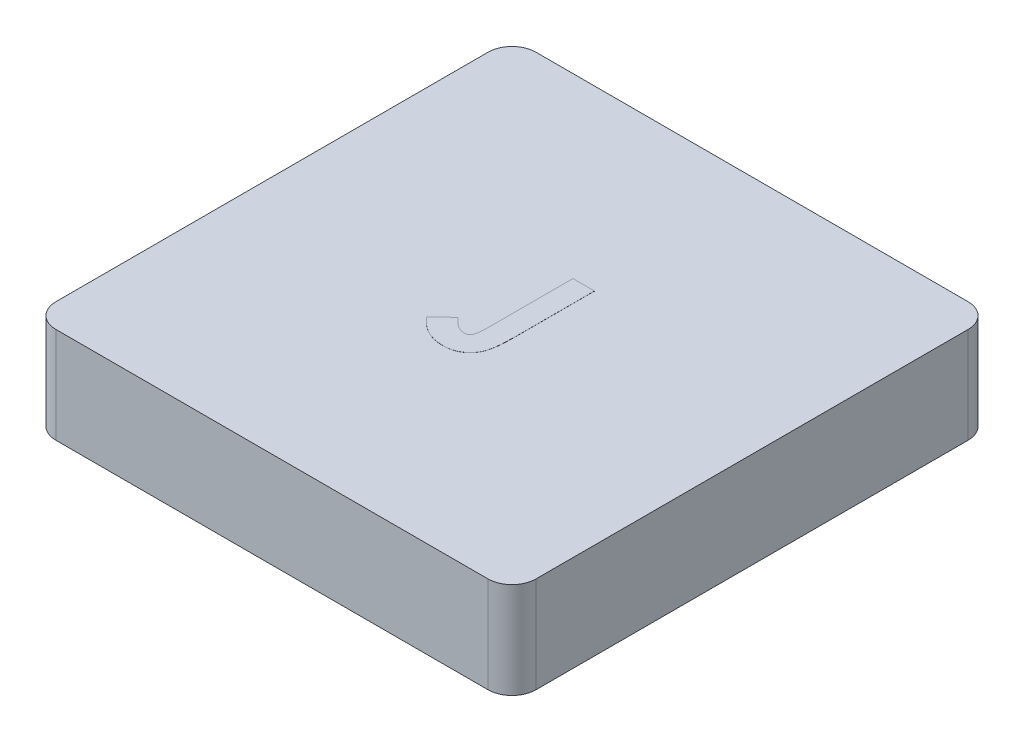
ISO-10303-21;
HEADER;
FILE_DESCRIPTION(('STEP AP214'),'2;1');
FILE_NAME('part.step','',(''),(''),'','','');
FILE_SCHEMA(('AUTOMOTIVE_DESIGN { 1 0 10303 214 1 1 1 1 }'));
ENDSEC;
DATA;
#1=APPLICATION_CONTEXT('core data for automotive mechanical design processes');
#2=APPLICATION_PROTOCOL_DEFINITION('international standard','automotive_design',2000,#1);
#3=PRODUCT_CONTEXT('',#1,'mechanical');
#4=PRODUCT('Part','Part','',(#3));
#5=PRODUCT_RELATED_PRODUCT_CATEGORY('part','',(#4));
#6=PRODUCT_DEFINITION_FORMATION('','',#4);
#7=PRODUCT_DEFINITION_CONTEXT('part definition',#1,'design');
#8=PRODUCT_DEFINITION('design','',#6,#7);
#9=PRODUCT_DEFINITION_SHAPE('','',#8);
#10=(LENGTH_UNIT() NAMED_UNIT(*) SI_UNIT(.MILLI.,.METRE.));
#11=(NAMED_UNIT(*) PLANE_ANGLE_UNIT() SI_UNIT($,.RADIAN.));
#12=(NAMED_UNIT(*) SI_UNIT($,.STERADIAN.) SOLID_ANGLE_UNIT());
#13=UNCERTAINTY_MEASURE_WITH_UNIT(LENGTH_MEASURE(1.E-05),#10,'distance_accuracy_value','');
#14=(GEOMETRIC_REPRESENTATION_CONTEXT(3) GLOBAL_UNCERTAINTY_ASSIGNED_CONTEXT((#13)) GLOBAL_UNIT_ASSIGNED_CONTEXT((#10,
#11,#12)) REPRESENTATION_CONTEXT('',''));
#15=CARTESIAN_POINT('',(0.,0.,0.));
#16=DIRECTION('',(0.,0.,1.));
#17=DIRECTION('',(1.,0.,0.));
#18=AXIS2_PLACEMENT_3D('',#15,#16,#17);
#19=CARTESIAN_POINT('',(0.,2.54,-12.7));
#20=DIRECTION('',(1.,0.,0.));
#21=DIRECTION('',(0.,0.,-1.));
#22=AXIS2_PLACEMENT_3D('',#19,#20,#21);
#23=PLANE('',#22);
#24=DIRECTION('',(0.,0.,1.));
#25=VECTOR('',#24,1.);
#26=CARTESIAN_POINT('',(0.,2.54,-12.7));
#27=LINE('',#26,#25);
#28=CARTESIAN_POINT('',(0.,2.54,-12.065));
#29=VERTEX_POINT('',#28);
#30=CARTESIAN_POINT('',(0.,2.54,-0.635));
#31=VERTEX_POINT('',#30);
#32=EDGE_CURVE('E329',#29,#31,#27,.T.);
#33=ORIENTED_EDGE('',*,*,#32,.F.);
#34=DIRECTION('',(0.,-1.,0.));
#35=VECTOR('',#34,1.);
#36=CARTESIAN_POINT('',(0.,2.54,-12.065));
#37=LINE('',#36,#35);
#38=CARTESIAN_POINT('',(0.,0.,-12.065));
#39=VERTEX_POINT('',#38);
#40=EDGE_CURVE('E350',#29,#39,#37,.T.);
#41=ORIENTED_EDGE('',*,*,#40,.T.);
#42=DIRECTION('',(0.,0.,1.));
#43=VECTOR('',#42,1.);
#44=CARTESIAN_POINT('',(0.,0.,-12.7));
#45=LINE('',#44,#43);
#46=CARTESIAN_POINT('',(0.,0.,-0.635));
#47=VERTEX_POINT('',#46);
#48=EDGE_CURVE('E339',#39,#47,#45,.T.);
#49=ORIENTED_EDGE('',*,*,#48,.T.);
#50=DIRECTION('',(0.,-1.,0.));
#51=VECTOR('',#50,1.);
#52=CARTESIAN_POINT('',(0.,2.54,-0.635));
#53=LINE('',#52,#51);
#54=EDGE_CURVE('E338',#47,#31,#53,.F.);
#55=ORIENTED_EDGE('',*,*,#54,.T.);
#56=EDGE_LOOP('',(#33,#41,#49,#55));
#57=FACE_BOUND('',#56,.T.);
#58=ADVANCED_FACE('F33',(#57),#23,.F.);
#59=CARTESIAN_POINT('',(0.,2.54,0.));
#60=DIRECTION('',(0.,0.,-1.));
#61=DIRECTION('',(-1.,0.,0.));
#62=AXIS2_PLACEMENT_3D('',#59,#60,#61);
#63=PLANE('',#62);
#64=DIRECTION('',(1.,0.,0.));
#65=VECTOR('',#64,1.);
#66=CARTESIAN_POINT('',(0.,0.,0.));
#67=LINE('',#66,#65);
#68=CARTESIAN_POINT('',(0.635,0.,0.));
#69=VERTEX_POINT('',#68);
#70=CARTESIAN_POINT('',(12.065,0.,0.));
#71=VERTEX_POINT('',#70);
#72=EDGE_CURVE('E324',#69,#71,#67,.T.);
#73=ORIENTED_EDGE('',*,*,#72,.T.);
#74=DIRECTION('',(0.,-1.,0.));
#75=VECTOR('',#74,1.);
#76=CARTESIAN_POINT('',(12.065,2.54,0.));
#77=LINE('',#76,#75);
#78=CARTESIAN_POINT('',(12.065,2.54,0.));
#79=VERTEX_POINT('',#78);
#80=EDGE_CURVE('E41',#71,#79,#77,.F.);
#81=ORIENTED_EDGE('',*,*,#80,.T.);
#82=DIRECTION('',(1.,0.,0.));
#83=VECTOR('',#82,1.);
#84=CARTESIAN_POINT('',(0.,2.54,0.));
#85=LINE('',#84,#83);
#86=CARTESIAN_POINT('',(0.635,2.54,0.));
#87=VERTEX_POINT('',#86);
#88=EDGE_CURVE('E321',#87,#79,#85,.T.);
#89=ORIENTED_EDGE('',*,*,#88,.F.);
#90=DIRECTION('',(0.,-1.,0.));
#91=VECTOR('',#90,1.);
#92=CARTESIAN_POINT('',(0.635,2.54,0.));
#93=LINE('',#92,#91);
#94=EDGE_CURVE('E317',#87,#69,#93,.T.);
#95=ORIENTED_EDGE('',*,*,#94,.T.);
#96=EDGE_LOOP('',(#73,#81,#89,#95));
#97=FACE_BOUND('',#96,.T.);
#98=ADVANCED_FACE('F273',(#97),#63,.F.);
#99=CARTESIAN_POINT('',(12.7,2.54,0.));
#100=DIRECTION('',(-1.,0.,0.));
#101=DIRECTION('',(0.,0.,1.));
#102=AXIS2_PLACEMENT_3D('',#99,#100,#101);
#103=PLANE('',#102);
#104=DIRECTION('',(0.,0.,-1.));
#105=VECTOR('',#104,1.);
#106=CARTESIAN_POINT('',(12.7,0.,0.));
#107=LINE('',#106,#105);
#108=CARTESIAN_POINT('',(12.7,0.,-0.635));
#109=VERTEX_POINT('',#108);
#110=CARTESIAN_POINT('',(12.7,0.,-12.065));
#111=VERTEX_POINT('',#110);
#112=EDGE_CURVE('E344',#109,#111,#107,.T.);
#113=ORIENTED_EDGE('',*,*,#112,.T.);
#114=DIRECTION('',(0.,-1.,0.));
#115=VECTOR('',#114,1.);
#116=CARTESIAN_POINT('',(12.7,2.54,-12.065));
#117=LINE('',#116,#115);
#118=CARTESIAN_POINT('',(12.7,2.54,-12.065));
#119=VERTEX_POINT('',#118);
#120=EDGE_CURVE('E315',#111,#119,#117,.F.);
#121=ORIENTED_EDGE('',*,*,#120,.T.);
#122=DIRECTION('',(0.,0.,-1.));
#123=VECTOR('',#122,1.);
#124=CARTESIAN_POINT('',(12.7,2.54,0.));
#125=LINE('',#124,#123);
#126=CARTESIAN_POINT('',(12.7,2.54,-0.635));
#127=VERTEX_POINT('',#126);
#128=EDGE_CURVE('E328',#127,#119,#125,.T.);
#129=ORIENTED_EDGE('',*,*,#128,.F.);
#130=DIRECTION('',(0.,-1.,0.));
#131=VECTOR('',#130,1.);
#132=CARTESIAN_POINT('',(12.7,2.54,-0.635));
#133=LINE('',#132,#131);
#134=EDGE_CURVE('E299',#127,#109,#133,.T.);
#135=ORIENTED_EDGE('',*,*,#134,.T.);
#136=EDGE_LOOP('',(#113,#121,#129,#135));
#137=FACE_BOUND('',#136,.T.);
#138=ADVANCED_FACE('F269',(#137),#103,.F.);
#139=CARTESIAN_POINT('',(12.7,2.54,-12.7));
#140=DIRECTION('',(0.,0.,1.));
#141=DIRECTION('',(1.,0.,0.));
#142=AXIS2_PLACEMENT_3D('',#139,#140,#141);
#143=PLANE('',#142);
#144=DIRECTION('',(-1.,0.,0.));
#145=VECTOR('',#144,1.);
#146=CARTESIAN_POINT('',(12.7,0.,-12.7));
#147=LINE('',#146,#145);
#148=CARTESIAN_POINT('',(12.065,0.,-12.7));
#149=VERTEX_POINT('',#148);
#150=CARTESIAN_POINT('',(0.634999999999995,0.,-12.7));
#151=VERTEX_POINT('',#150);
#152=EDGE_CURVE('E333',#149,#151,#147,.T.);
#153=ORIENTED_EDGE('',*,*,#152,.T.);
#154=DIRECTION('',(0.,-1.,0.));
#155=VECTOR('',#154,1.);
#156=CARTESIAN_POINT('',(0.634999999999995,2.54,-12.7));
#157=LINE('',#156,#155);
#158=CARTESIAN_POINT('',(0.634999999999995,2.54,-12.7));
#159=VERTEX_POINT('',#158);
#160=EDGE_CURVE('E309',#151,#159,#157,.F.);
#161=ORIENTED_EDGE('',*,*,#160,.T.);
#162=DIRECTION('',(-1.,0.,0.));
#163=VECTOR('',#162,1.);
#164=CARTESIAN_POINT('',(12.7,2.54,-12.7));
#165=LINE('',#164,#163);
#166=CARTESIAN_POINT('',(12.065,2.54,-12.7));
#167=VERTEX_POINT('',#166);
#168=EDGE_CURVE('E331',#167,#159,#165,.T.);
#169=ORIENTED_EDGE('',*,*,#168,.F.);
#170=DIRECTION('',(0.,-1.,0.));
#171=VECTOR('',#170,1.);
#172=CARTESIAN_POINT('',(12.065,2.54,-12.7));
#173=LINE('',#172,#171);
#174=EDGE_CURVE('E361',#167,#149,#173,.T.);
#175=ORIENTED_EDGE('',*,*,#174,.T.);
#176=EDGE_LOOP('',(#153,#161,#169,#175));
#177=FACE_BOUND('',#176,.T.);
#178=ADVANCED_FACE('F262',(#177),#143,.F.);
#179=CARTESIAN_POINT('',(0.,2.54,0.));
#180=DIRECTION('',(0.,1.,0.));
#181=DIRECTION('',(0.,0.,1.));
#182=AXIS2_PLACEMENT_3D('',#179,#180,#181);
#183=PLANE('',#182);
#184=DIRECTION('',(0.,0.,-1.));
#185=VECTOR('',#184,1.);
#186=CARTESIAN_POINT('',(6.31124871794871,2.54,-5.76094591346154));
#187=LINE('',#186,#185);
#188=CARTESIAN_POINT('',(6.31124871794871,2.54,-5.76094591346154));
#189=VERTEX_POINT('',#188);
#190=CARTESIAN_POINT('',(6.31124871794871,2.54,-8.001));
#191=VERTEX_POINT('',#190);
#192=EDGE_CURVE('E465',#189,#191,#187,.T.);
#193=ORIENTED_EDGE('',*,*,#192,.T.);
#194=DIRECTION('',(1.,0.,0.));
#195=VECTOR('',#194,1.);
#196=CARTESIAN_POINT('',(6.31124871794871,2.54,-8.001));
#197=LINE('',#196,#195);
#198=CARTESIAN_POINT('',(6.88112051282051,2.54,-8.001));
#199=VERTEX_POINT('',#198);
#200=EDGE_CURVE('E175',#191,#199,#197,.T.);
#201=ORIENTED_EDGE('',*,*,#200,.T.);
#202=DIRECTION('',(0.,0.,1.));
#203=VECTOR('',#202,1.);
#204=CARTESIAN_POINT('',(6.88112051282051,2.54,-8.001));
#205=LINE('',#204,#203);
#206=CARTESIAN_POINT('',(6.88112051282051,2.54,-5.89323758012821));
#207=VERTEX_POINT('',#206);
#208=EDGE_CURVE('E459',#199,#207,#205,.T.);
#209=ORIENTED_EDGE('',*,*,#208,.T.);
#210=CARTESIAN_POINT('',(6.88112051282051,2.54,-5.89323758012821));
#211=CARTESIAN_POINT('',(6.88091158071687,2.54,-5.85295254026278));
#212=CARTESIAN_POINT('',(6.88050900980352,2.54,-5.77533122209071));
#213=CARTESIAN_POINT('',(6.87647856088049,2.54,-5.66358517718184));
#214=CARTESIAN_POINT('',(6.87102868321345,2.54,-5.5611307310824));
#215=CARTESIAN_POINT('',(6.86318033355562,2.54,-5.46813204890725));
#216=CARTESIAN_POINT('',(6.85152338550951,2.54,-5.38459362780468));
#217=CARTESIAN_POINT('',(6.83833125978952,2.54,-5.31030704710015));
#218=CARTESIAN_POINT('',(6.82377668325185,2.54,-5.24496960972293));
#219=CARTESIAN_POINT('',(6.79919043205469,2.54,-5.17184685241292));
#220=CARTESIAN_POINT('',(6.76102098955045,2.54,-5.09087171656997));
#221=CARTESIAN_POINT('',(6.70342221127467,2.54,-5.00340706265142));
#222=CARTESIAN_POINT('',(6.63169329612528,2.54,-4.92741518238404));
#223=CARTESIAN_POINT('',(6.54908527900529,2.54,-4.86140745091114));
#224=CARTESIAN_POINT('',(6.45490212622968,2.54,-4.80914181373395));
#225=CARTESIAN_POINT('',(6.3513135961728,2.54,-4.77136407124898));
#226=CARTESIAN_POINT('',(6.23865083670719,2.54,-4.74879538622335));
#227=CARTESIAN_POINT('',(6.16061770898194,2.54,-4.74601908432728));
#228=CARTESIAN_POINT('',(6.12044342948717,2.54,-4.74458974358974));
#229=B_SPLINE_CURVE_WITH_KNOTS('',3,(#210,#211,#212,#213,#214,#215,#216,#217,#218,#219,#220,
#221,#222,#223,#224,#225,#226,#227,#228),.UNSPECIFIED.,.F.,.F.,(4,1,1,1,1,1,1,1,1,1,1,1,1,1,1,1,
4),(0.,0.0764053506058016,0.147218025580542,0.212058993569066,0.270999490309766,
0.324170992612472,0.371969814615873,0.414105230295776,0.450981256131895,0.518077209357027,
0.583319665547195,0.64875638268336,0.715449883456707,0.783134877260214,0.852084921522458,
0.923847962045423,1.),.UNSPECIFIED.);
#230=CARTESIAN_POINT('',(6.12044342948717,2.54,-4.74458974358974));
#231=VERTEX_POINT('',#230);
#232=EDGE_CURVE('E452',#207,#231,#229,.T.);
#233=ORIENTED_EDGE('',*,*,#232,.T.);
#234=CARTESIAN_POINT('',(6.12044342948718,2.54,-4.74458974358974));
#235=CARTESIAN_POINT('',(6.07858548605364,2.54,-4.74588561737008));
#236=CARTESIAN_POINT('',(5.99602527611185,2.54,-4.7484415865025));
#237=CARTESIAN_POINT('',(5.87494222556327,2.54,-4.77021187962806));
#238=CARTESIAN_POINT('',(5.7585662778997,2.54,-4.80511621003476));
#239=CARTESIAN_POINT('',(5.64749950097126,2.54,-4.85558368264152));
#240=CARTESIAN_POINT('',(5.54022024622526,2.54,-4.91880101083569));
#241=CARTESIAN_POINT('',(5.4386755338055,2.54,-4.99721595323105));
#242=CARTESIAN_POINT('',(5.34074524957005,2.54,-5.08839651853344));
#243=CARTESIAN_POINT('',(5.28269157928034,2.54,-5.15836619606181));
#244=CARTESIAN_POINT('',(5.25291538461538,2.54,-5.19425420673077));
#245=B_SPLINE_CURVE_WITH_KNOTS('',3,(#234,#235,#236,#237,#238,#239,#240,#241,#242,#243,#244),
.UNSPECIFIED.,.F.,.F.,(4,1,1,1,1,1,1,1,4),(0.,0.123873098257655,0.24432612210228,
0.363091916241498,0.482806410598963,0.604690738529227,0.73101201523036,0.862033897993612,1.),.UNSPECIFIED.);
#246=CARTESIAN_POINT('',(5.25291538461538,2.54,-5.19425420673077));
#247=VERTEX_POINT('',#246);
#248=EDGE_CURVE('E448',#231,#247,#245,.T.);
#249=ORIENTED_EDGE('',*,*,#248,.T.);
#250=DIRECTION('',(0.734180402826144,0.,-0.678954443321524));
#251=VECTOR('',#250,1.);
#252=CARTESIAN_POINT('',(5.25291538461538,2.54,-5.19425420673077));
#253=LINE('',#252,#251);
#254=CARTESIAN_POINT('',(5.68413533653846,2.54,-5.59303725961538));
#255=VERTEX_POINT('',#254);
#256=EDGE_CURVE('E443',#247,#255,#253,.T.);
#257=ORIENTED_EDGE('',*,*,#256,.T.);
#258=CARTESIAN_POINT('',(5.68413533653846,2.54,-5.59303725961538));
#259=CARTESIAN_POINT('',(5.70671352651177,2.54,-5.56750770293782));
#260=CARTESIAN_POINT('',(5.74896338985391,2.54,-5.51973503904901));
#261=CARTESIAN_POINT('',(5.81263268837479,2.54,-5.45743831205905));
#262=CARTESIAN_POINT('',(5.87006582634923,2.54,-5.40739008234386));
#263=CARTESIAN_POINT('',(5.92420626490365,2.54,-5.37128984356978));
#264=CARTESIAN_POINT('',(5.9752972979457,2.54,-5.34584320525591));
#265=CARTESIAN_POINT('',(6.02443818485929,2.54,-5.3275132762469));
#266=CARTESIAN_POINT('',(6.07316071775475,2.54,-5.3171374954758));
#267=CARTESIAN_POINT('',(6.10534830861267,2.54,-5.31534002274066));
#268=CARTESIAN_POINT('',(6.12107944711538,2.54,-5.31446153846154));
#269=B_SPLINE_CURVE_WITH_KNOTS('',3,(#258,#259,#260,#261,#262,#263,#264,#265,#266,#267,#268),
.UNSPECIFIED.,.F.,.F.,(4,1,1,1,1,1,1,1,4),(0.,0.191188734676117,0.357765521601646,
0.499586074062439,0.618044672839495,0.721795541859931,0.819272160926337,0.911672337320495,1.),.UNSPECIFIED.);
#270=CARTESIAN_POINT('',(6.12107944711538,2.54,-5.31446153846154));
#271=VERTEX_POINT('',#270);
#272=EDGE_CURVE('E53',#255,#271,#269,.T.);
#273=ORIENTED_EDGE('',*,*,#272,.T.);
#274=CARTESIAN_POINT('',(6.12107944711538,2.54,-5.31446153846154));
#275=CARTESIAN_POINT('',(6.13630543818843,2.54,-5.31525554937598));
#276=CARTESIAN_POINT('',(6.16558001345695,2.54,-5.31678217133231));
#277=CARTESIAN_POINT('',(6.20583367711112,2.54,-5.33375250942066));
#278=CARTESIAN_POINT('',(6.23977010602246,2.54,-5.36039665373477));
#279=CARTESIAN_POINT('',(6.26211184775168,2.54,-5.39102755498271));
#280=CARTESIAN_POINT('',(6.27634945003849,2.54,-5.42234058242528));
#281=CARTESIAN_POINT('',(6.28524537230499,2.54,-5.4526094371274));
#282=CARTESIAN_POINT('',(6.29368761792642,2.54,-5.48889359012024));
#283=CARTESIAN_POINT('',(6.30045135684294,2.54,-5.53117485612093));
#284=CARTESIAN_POINT('',(6.30556205012265,2.54,-5.58000473647157));
#285=CARTESIAN_POINT('',(6.3081093612352,2.54,-5.634790439109));
#286=CARTESIAN_POINT('',(6.31120721828109,2.54,-5.69582801747516));
#287=CARTESIAN_POINT('',(6.31123439280349,2.54,-5.73846806315622));
#288=CARTESIAN_POINT('',(6.31124871794871,2.54,-5.76094591346154));
#289=B_SPLINE_CURVE_WITH_KNOTS('',3,(#274,#275,#276,#277,#278,#279,#280,#281,#282,#283,#284,
#285,#286,#287,#288),.UNSPECIFIED.,.F.,.F.,(4,1,1,1,1,1,1,1,1,1,1,1,4),(0.,0.0836606106248744,
0.160851850693831,0.236744462245999,0.319647798711959,0.36732551225643,0.426209548529816,
0.493524089529687,0.573025277738409,0.66250602050281,0.764543201859918,0.875878119325884,1.),.UNSPECIFIED.);
#290=EDGE_CURVE('E48',#271,#189,#289,.T.);
#291=ORIENTED_EDGE('',*,*,#290,.T.);
#292=EDGE_LOOP('',(#193,#201,#209,#233,#249,#257,#273,#291));
#293=FACE_BOUND('',#292,.T.);
#294=ORIENTED_EDGE('',*,*,#168,.T.);
#295=CARTESIAN_POINT('',(0.634999999999995,2.54,-12.065));
#296=DIRECTION('',(0.,1.,0.));
#297=DIRECTION('',(0.,0.,1.));
#298=AXIS2_PLACEMENT_3D('',#295,#296,#297);
#299=CIRCLE('',#298,0.635);
#300=EDGE_CURVE('E307',#159,#29,#299,.T.);
#301=ORIENTED_EDGE('',*,*,#300,.T.);
#302=ORIENTED_EDGE('',*,*,#32,.T.);
#303=CARTESIAN_POINT('',(0.635,2.54,-0.635));
#304=DIRECTION('',(0.,1.,0.));
#305=DIRECTION('',(0.,0.,1.));
#306=AXIS2_PLACEMENT_3D('',#303,#304,#305);
#307=CIRCLE('',#306,0.635);
#308=EDGE_CURVE('E305',#31,#87,#307,.T.);
#309=ORIENTED_EDGE('',*,*,#308,.T.);
#310=ORIENTED_EDGE('',*,*,#88,.T.);
#311=CARTESIAN_POINT('',(12.065,2.54,-0.635));
#312=DIRECTION('',(0.,1.,0.));
#313=DIRECTION('',(0.,0.,1.));
#314=AXIS2_PLACEMENT_3D('',#311,#312,#313);
#315=CIRCLE('',#314,0.635);
#316=EDGE_CURVE('E297',#79,#127,#315,.T.);
#317=ORIENTED_EDGE('',*,*,#316,.T.);
#318=ORIENTED_EDGE('',*,*,#128,.T.);
#319=CARTESIAN_POINT('',(12.065,2.54,-12.065));
#320=DIRECTION('',(0.,1.,0.));
#321=DIRECTION('',(0.,0.,1.));
#322=AXIS2_PLACEMENT_3D('',#319,#320,#321);
#323=CIRCLE('',#322,0.635);
#324=EDGE_CURVE('E304',#119,#167,#323,.T.);
#325=ORIENTED_EDGE('',*,*,#324,.T.);
#326=EDGE_LOOP('',(#294,#301,#302,#309,#310,#317,#318,#325));
#327=FACE_BOUND('',#326,.T.);
#328=ADVANCED_FACE('F258',(#293,#327),#183,.T.);
#329=CARTESIAN_POINT('',(0.,0.,0.));
#330=DIRECTION('',(0.,1.,0.));
#331=DIRECTION('',(0.,0.,1.));
#332=AXIS2_PLACEMENT_3D('',#329,#330,#331);
#333=PLANE('',#332);
#334=DIRECTION('',(-1.,0.,0.));
#335=VECTOR('',#334,1.);
#336=CARTESIAN_POINT('',(12.7,0.,-12.065));
#337=LINE('',#336,#335);
#338=CARTESIAN_POINT('',(12.065,0.,-12.065));
#339=VERTEX_POINT('',#338);
#340=CARTESIAN_POINT('',(0.634999999999995,0.,-12.065));
#341=VERTEX_POINT('',#340);
#342=EDGE_CURVE('E402',#339,#341,#337,.T.);
#343=ORIENTED_EDGE('',*,*,#342,.T.);
#344=DIRECTION('',(0.,0.,1.));
#345=VECTOR('',#344,1.);
#346=CARTESIAN_POINT('',(0.634999999999995,0.,-12.7));
#347=LINE('',#346,#345);
#348=CARTESIAN_POINT('',(0.635,0.,-0.635));
#349=VERTEX_POINT('',#348);
#350=EDGE_CURVE('E397',#341,#349,#347,.T.);
#351=ORIENTED_EDGE('',*,*,#350,.T.);
#352=DIRECTION('',(1.,0.,0.));
#353=VECTOR('',#352,1.);
#354=CARTESIAN_POINT('',(0.,0.,-0.635));
#355=LINE('',#354,#353);
#356=CARTESIAN_POINT('',(12.065,0.,-0.635));
#357=VERTEX_POINT('',#356);
#358=EDGE_CURVE('E400',#349,#357,#355,.T.);
#359=ORIENTED_EDGE('',*,*,#358,.T.);
#360=DIRECTION('',(0.,0.,-1.));
#361=VECTOR('',#360,1.);
#362=CARTESIAN_POINT('',(12.065,0.,0.));
#363=LINE('',#362,#361);
#364=EDGE_CURVE('E405',#357,#339,#363,.T.);
#365=ORIENTED_EDGE('',*,*,#364,.T.);
#366=EDGE_LOOP('',(#343,#351,#359,#365));
#367=FACE_BOUND('',#366,.T.);
#368=ORIENTED_EDGE('',*,*,#48,.F.);
#369=CARTESIAN_POINT('',(0.634999999999995,0.,-12.065));
#370=DIRECTION('',(0.,1.,0.));
#371=DIRECTION('',(0.,0.,1.));
#372=AXIS2_PLACEMENT_3D('',#369,#370,#371);
#373=CIRCLE('',#372,0.635);
#374=EDGE_CURVE('E359',#39,#151,#373,.F.);
#375=ORIENTED_EDGE('',*,*,#374,.T.);
#376=ORIENTED_EDGE('',*,*,#152,.F.);
#377=CARTESIAN_POINT('',(12.065,0.,-12.065));
#378=DIRECTION('',(0.,1.,0.));
#379=DIRECTION('',(0.,0.,1.));
#380=AXIS2_PLACEMENT_3D('',#377,#378,#379);
#381=CIRCLE('',#380,0.635);
#382=EDGE_CURVE('E357',#149,#111,#381,.F.);
#383=ORIENTED_EDGE('',*,*,#382,.T.);
#384=ORIENTED_EDGE('',*,*,#112,.F.);
#385=CARTESIAN_POINT('',(12.065,0.,-0.635));
#386=DIRECTION('',(0.,1.,0.));
#387=DIRECTION('',(0.,0.,1.));
#388=AXIS2_PLACEMENT_3D('',#385,#386,#387);
#389=CIRCLE('',#388,0.635);
#390=EDGE_CURVE('E355',#109,#71,#389,.F.);
#391=ORIENTED_EDGE('',*,*,#390,.T.);
#392=ORIENTED_EDGE('',*,*,#72,.F.);
#393=CARTESIAN_POINT('',(0.635,0.,-0.635));
#394=DIRECTION('',(0.,1.,0.));
#395=DIRECTION('',(0.,0.,1.));
#396=AXIS2_PLACEMENT_3D('',#393,#394,#395);
#397=CIRCLE('',#396,0.635);
#398=EDGE_CURVE('E353',#69,#47,#397,.F.);
#399=ORIENTED_EDGE('',*,*,#398,.T.);
#400=EDGE_LOOP('',(#368,#375,#376,#383,#384,#391,#392,#399));
#401=FACE_BOUND('',#400,.T.);
#402=ADVANCED_FACE('F261',(#367,#401),#333,.F.);
#403=CARTESIAN_POINT('',(0.634999999999995,2.54,-12.065));
#404=DIRECTION('',(0.,-1.,0.));
#405=DIRECTION('',(0.,0.,-1.));
#406=AXIS2_PLACEMENT_3D('',#403,#404,#405);
#407=CYLINDRICAL_SURFACE('',#406,0.635);
#408=ORIENTED_EDGE('',*,*,#300,.F.);
#409=ORIENTED_EDGE('',*,*,#160,.F.);
#410=ORIENTED_EDGE('',*,*,#374,.F.);
#411=ORIENTED_EDGE('',*,*,#40,.F.);
#412=EDGE_LOOP('',(#408,#409,#410,#411));
#413=FACE_BOUND('',#412,.T.);
#414=ADVANCED_FACE('F265',(#413),#407,.T.);
#415=CARTESIAN_POINT('',(12.065,2.54,-12.065));
#416=DIRECTION('',(0.,-1.,0.));
#417=DIRECTION('',(0.,0.,-1.));
#418=AXIS2_PLACEMENT_3D('',#415,#416,#417);
#419=CYLINDRICAL_SURFACE('',#418,0.635);
#420=ORIENTED_EDGE('',*,*,#324,.F.);
#421=ORIENTED_EDGE('',*,*,#120,.F.);
#422=ORIENTED_EDGE('',*,*,#382,.F.);
#423=ORIENTED_EDGE('',*,*,#174,.F.);
#424=EDGE_LOOP('',(#420,#421,#422,#423));
#425=FACE_BOUND('',#424,.T.);
#426=ADVANCED_FACE('F283',(#425),#419,.T.);
#427=CARTESIAN_POINT('',(12.065,2.54,-0.635));
#428=DIRECTION('',(0.,-1.,0.));
#429=DIRECTION('',(0.,0.,-1.));
#430=AXIS2_PLACEMENT_3D('',#427,#428,#429);
#431=CYLINDRICAL_SURFACE('',#430,0.635);
#432=ORIENTED_EDGE('',*,*,#316,.F.);
#433=ORIENTED_EDGE('',*,*,#80,.F.);
#434=ORIENTED_EDGE('',*,*,#390,.F.);
#435=ORIENTED_EDGE('',*,*,#134,.F.);
#436=EDGE_LOOP('',(#432,#433,#434,#435));
#437=FACE_BOUND('',#436,.T.);
#438=ADVANCED_FACE('F286',(#437),#431,.T.);
#439=CARTESIAN_POINT('',(0.635,2.54,-0.635));
#440=DIRECTION('',(0.,-1.,0.));
#441=DIRECTION('',(0.,0.,-1.));
#442=AXIS2_PLACEMENT_3D('',#439,#440,#441);
#443=CYLINDRICAL_SURFACE('',#442,0.635);
#444=ORIENTED_EDGE('',*,*,#308,.F.);
#445=ORIENTED_EDGE('',*,*,#54,.F.);
#446=ORIENTED_EDGE('',*,*,#398,.F.);
#447=ORIENTED_EDGE('',*,*,#94,.F.);
#448=EDGE_LOOP('',(#444,#445,#446,#447));
#449=FACE_BOUND('',#448,.T.);
#450=ADVANCED_FACE('F35',(#449),#443,.T.);
#451=CARTESIAN_POINT('',(0.634999999999995,2.54,-12.7));
#452=DIRECTION('',(1.,0.,0.));
#453=DIRECTION('',(0.,0.,-1.));
#454=AXIS2_PLACEMENT_3D('',#451,#452,#453);
#455=PLANE('',#454);
#456=DIRECTION('',(0.,0.,1.));
#457=VECTOR('',#456,1.);
#458=CARTESIAN_POINT('',(0.634999999999995,1.905,-12.7));
#459=LINE('',#458,#457);
#460=CARTESIAN_POINT('',(0.634999999999995,1.905,-12.065));
#461=VERTEX_POINT('',#460);
#462=CARTESIAN_POINT('',(0.635,1.905,-0.635));
#463=VERTEX_POINT('',#462);
#464=EDGE_CURVE('E391',#461,#463,#459,.T.);
#465=ORIENTED_EDGE('',*,*,#464,.T.);
#466=DIRECTION('',(0.,1.,0.));
#467=VECTOR('',#466,1.);
#468=CARTESIAN_POINT('',(0.635,2.54,-0.635));
#469=LINE('',#468,#467);
#470=EDGE_CURVE('E387',#349,#463,#469,.T.);
#471=ORIENTED_EDGE('',*,*,#470,.F.);
#472=ORIENTED_EDGE('',*,*,#350,.F.);
#473=DIRECTION('',(0.,1.,0.));
#474=VECTOR('',#473,1.);
#475=CARTESIAN_POINT('',(0.634999999999995,2.54,-12.065));
#476=LINE('',#475,#474);
#477=EDGE_CURVE('E383',#341,#461,#476,.T.);
#478=ORIENTED_EDGE('',*,*,#477,.T.);
#479=EDGE_LOOP('',(#465,#471,#472,#478));
#480=FACE_BOUND('',#479,.T.);
#481=ADVANCED_FACE('F239',(#480),#455,.T.);
#482=CARTESIAN_POINT('',(0.,2.54,-0.635));
#483=DIRECTION('',(0.,0.,-1.));
#484=DIRECTION('',(-1.,0.,0.));
#485=AXIS2_PLACEMENT_3D('',#482,#483,#484);
#486=PLANE('',#485);
#487=ORIENTED_EDGE('',*,*,#358,.F.);
#488=ORIENTED_EDGE('',*,*,#470,.T.);
#489=DIRECTION('',(1.,0.,0.));
#490=VECTOR('',#489,1.);
#491=CARTESIAN_POINT('',(0.,1.905,-0.635));
#492=LINE('',#491,#490);
#493=CARTESIAN_POINT('',(12.065,1.905,-0.635));
#494=VERTEX_POINT('',#493);
#495=EDGE_CURVE('E389',#463,#494,#492,.T.);
#496=ORIENTED_EDGE('',*,*,#495,.T.);
#497=DIRECTION('',(0.,1.,0.));
#498=VECTOR('',#497,1.);
#499=CARTESIAN_POINT('',(12.065,2.54,-0.635));
#500=LINE('',#499,#498);
#501=EDGE_CURVE('E342',#357,#494,#500,.T.);
#502=ORIENTED_EDGE('',*,*,#501,.F.);
#503=EDGE_LOOP('',(#487,#488,#496,#502));
#504=FACE_BOUND('',#503,.T.);
#505=ADVANCED_FACE('F242',(#504),#486,.T.);
#506=CARTESIAN_POINT('',(12.065,2.54,0.));
#507=DIRECTION('',(-1.,0.,0.));
#508=DIRECTION('',(0.,0.,1.));
#509=AXIS2_PLACEMENT_3D('',#506,#507,#508);
#510=PLANE('',#509);
#511=ORIENTED_EDGE('',*,*,#364,.F.);
#512=ORIENTED_EDGE('',*,*,#501,.T.);
#513=DIRECTION('',(0.,0.,-1.));
#514=VECTOR('',#513,1.);
#515=CARTESIAN_POINT('',(12.065,1.905,0.));
#516=LINE('',#515,#514);
#517=CARTESIAN_POINT('',(12.065,1.905,-12.065));
#518=VERTEX_POINT('',#517);
#519=EDGE_CURVE('E390',#494,#518,#516,.T.);
#520=ORIENTED_EDGE('',*,*,#519,.T.);
#521=DIRECTION('',(0.,1.,0.));
#522=VECTOR('',#521,1.);
#523=CARTESIAN_POINT('',(12.065,2.54,-12.065));
#524=LINE('',#523,#522);
#525=EDGE_CURVE('E377',#339,#518,#524,.T.);
#526=ORIENTED_EDGE('',*,*,#525,.F.);
#527=EDGE_LOOP('',(#511,#512,#520,#526));
#528=FACE_BOUND('',#527,.T.);
#529=ADVANCED_FACE('F246',(#528),#510,.T.);
#530=CARTESIAN_POINT('',(12.7,2.54,-12.065));
#531=DIRECTION('',(0.,0.,1.));
#532=DIRECTION('',(1.,0.,0.));
#533=AXIS2_PLACEMENT_3D('',#530,#531,#532);
#534=PLANE('',#533);
#535=ORIENTED_EDGE('',*,*,#342,.F.);
#536=ORIENTED_EDGE('',*,*,#525,.T.);
#537=DIRECTION('',(-1.,0.,0.));
#538=VECTOR('',#537,1.);
#539=CARTESIAN_POINT('',(12.7,1.905,-12.065));
#540=LINE('',#539,#538);
#541=EDGE_CURVE('E394',#518,#461,#540,.T.);
#542=ORIENTED_EDGE('',*,*,#541,.T.);
#543=ORIENTED_EDGE('',*,*,#477,.F.);
#544=EDGE_LOOP('',(#535,#536,#542,#543));
#545=FACE_BOUND('',#544,.T.);
#546=ADVANCED_FACE('F250',(#545),#534,.T.);
#547=CARTESIAN_POINT('',(0.,1.905,0.));
#548=DIRECTION('',(0.,1.,0.));
#549=DIRECTION('',(0.,0.,1.));
#550=AXIS2_PLACEMENT_3D('',#547,#548,#549);
#551=PLANE('',#550);
#552=CARTESIAN_POINT('',(6.34999999999999,1.905,-6.35));
#553=DIRECTION('',(0.,1.,0.));
#554=DIRECTION('',(0.,0.,1.));
#555=AXIS2_PLACEMENT_3D('',#552,#553,#554);
#556=CIRCLE('',#555,2.54);
#557=CARTESIAN_POINT('',(6.34999999999999,1.905,-3.81));
#558=VERTEX_POINT('',#557);
#559=EDGE_CURVE('E11',#558,#558,#556,.F.);
#560=ORIENTED_EDGE('',*,*,#559,.F.);
#561=EDGE_LOOP('',(#560));
#562=FACE_BOUND('',#561,.T.);
#563=ORIENTED_EDGE('',*,*,#541,.F.);
#564=ORIENTED_EDGE('',*,*,#519,.F.);
#565=ORIENTED_EDGE('',*,*,#495,.F.);
#566=ORIENTED_EDGE('',*,*,#464,.F.);
#567=EDGE_LOOP('',(#563,#564,#565,#566));
#568=FACE_BOUND('',#567,.T.);
#569=ADVANCED_FACE('F237',(#562,#568),#551,.F.);
#570=CARTESIAN_POINT('',(6.34999999999999,-7.18420489685532,-6.35));
#571=DIRECTION('',(0.,1.,0.));
#572=DIRECTION('',(0.,0.,1.));
#573=AXIS2_PLACEMENT_3D('',#570,#571,#572);
#574=CYLINDRICAL_SURFACE('',#573,2.54);
#575=CARTESIAN_POINT('',(6.34999999999999,0.,-6.35));
#576=DIRECTION('',(0.,1.,0.));
#577=DIRECTION('',(0.,0.,1.));
#578=AXIS2_PLACEMENT_3D('',#575,#576,#577);
#579=CIRCLE('',#578,2.54);
#580=CARTESIAN_POINT('',(6.34999999999999,0.,-3.81));
#581=VERTEX_POINT('',#580);
#582=EDGE_CURVE('E401',#581,#581,#579,.T.);
#583=CARTESIAN_POINT('',(6.34999999999999,0.,-3.81));
#584=CARTESIAN_POINT('',(6.34999999999999,0.0198437499999991,-3.81));
#585=CARTESIAN_POINT('',(6.34999999999999,0.0396874999999989,-3.81));
#586=CARTESIAN_POINT('',(6.34999999999999,0.079374999999999,-3.81));
#587=CARTESIAN_POINT('',(6.34999999999999,0.0992187499999992,-3.81));
#588=CARTESIAN_POINT('',(6.34999999999999,0.138906249999999,-3.81));
#589=CARTESIAN_POINT('',(6.34999999999999,0.158749999999999,-3.81));
#590=CARTESIAN_POINT('',(6.34999999999999,0.198437499999999,-3.81));
#591=CARTESIAN_POINT('',(6.34999999999999,0.218281249999999,-3.81));
#592=CARTESIAN_POINT('',(6.34999999999999,0.25796875,-3.81));
#593=CARTESIAN_POINT('',(6.34999999999999,0.277812499999999,-3.81));
#594=CARTESIAN_POINT('',(6.34999999999999,0.317499999999999,-3.81));
#595=CARTESIAN_POINT('',(6.34999999999999,0.337343749999999,-3.81));
#596=CARTESIAN_POINT('',(6.34999999999999,0.377031249999999,-3.81));
#597=CARTESIAN_POINT('',(6.34999999999999,0.396874999999999,-3.81));
#598=CARTESIAN_POINT('',(6.34999999999999,0.436562499999999,-3.81));
#599=CARTESIAN_POINT('',(6.34999999999999,0.456406249999999,-3.81));
#600=CARTESIAN_POINT('',(6.34999999999999,0.496093749999999,-3.81));
#601=CARTESIAN_POINT('',(6.34999999999999,0.515937499999999,-3.81));
#602=CARTESIAN_POINT('',(6.34999999999999,0.555624999999999,-3.81));
#603=CARTESIAN_POINT('',(6.34999999999999,0.575468749999999,-3.81));
#604=CARTESIAN_POINT('',(6.34999999999999,0.615156249999999,-3.81));
#605=CARTESIAN_POINT('',(6.34999999999999,0.634999999999999,-3.81));
#606=CARTESIAN_POINT('',(6.34999999999999,0.674687499999998,-3.81));
#607=CARTESIAN_POINT('',(6.34999999999999,0.694531249999998,-3.81));
#608=CARTESIAN_POINT('',(6.34999999999999,0.734218749999998,-3.81));
#609=CARTESIAN_POINT('',(6.34999999999999,0.754062499999998,-3.81));
#610=CARTESIAN_POINT('',(6.34999999999999,0.793749999999998,-3.81));
#611=CARTESIAN_POINT('',(6.34999999999999,0.813593749999999,-3.81));
#612=CARTESIAN_POINT('',(6.34999999999999,0.853281249999999,-3.81));
#613=CARTESIAN_POINT('',(6.34999999999999,0.873124999999999,-3.81));
#614=CARTESIAN_POINT('',(6.34999999999999,0.912812499999999,-3.81));
#615=CARTESIAN_POINT('',(6.34999999999999,0.932656249999999,-3.81));
#616=CARTESIAN_POINT('',(6.34999999999999,0.972343749999998,-3.81));
#617=CARTESIAN_POINT('',(6.34999999999999,0.992187499999998,-3.81));
#618=CARTESIAN_POINT('',(6.34999999999999,1.031875,-3.81));
#619=CARTESIAN_POINT('',(6.34999999999999,1.05171875,-3.81));
#620=CARTESIAN_POINT('',(6.34999999999999,1.09140625,-3.81));
#621=CARTESIAN_POINT('',(6.34999999999999,1.11125,-3.81));
#622=CARTESIAN_POINT('',(6.34999999999999,1.1509375,-3.81));
#623=CARTESIAN_POINT('',(6.34999999999999,1.17078125,-3.81));
#624=CARTESIAN_POINT('',(6.34999999999999,1.21046875,-3.81));
#625=CARTESIAN_POINT('',(6.34999999999999,1.2303125,-3.81));
#626=CARTESIAN_POINT('',(6.34999999999999,1.27,-3.81));
#627=CARTESIAN_POINT('',(6.34999999999999,1.28984375,-3.81));
#628=CARTESIAN_POINT('',(6.34999999999999,1.32953125,-3.81));
#629=CARTESIAN_POINT('',(6.34999999999999,1.349375,-3.81));
#630=CARTESIAN_POINT('',(6.34999999999999,1.3890625,-3.81));
#631=CARTESIAN_POINT('',(6.34999999999999,1.40890625,-3.81));
#632=CARTESIAN_POINT('',(6.34999999999999,1.44859375,-3.81));
#633=CARTESIAN_POINT('',(6.34999999999999,1.4684375,-3.81));
#634=CARTESIAN_POINT('',(6.34999999999999,1.508125,-3.81));
#635=CARTESIAN_POINT('',(6.34999999999999,1.52796875,-3.81));
#636=CARTESIAN_POINT('',(6.34999999999999,1.56765625,-3.81));
#637=CARTESIAN_POINT('',(6.34999999999999,1.5875,-3.81));
#638=CARTESIAN_POINT('',(6.34999999999999,1.6271875,-3.81));
#639=CARTESIAN_POINT('',(6.34999999999999,1.64703125,-3.81));
#640=CARTESIAN_POINT('',(6.34999999999999,1.68671875,-3.81));
#641=CARTESIAN_POINT('',(6.34999999999999,1.7065625,-3.81));
#642=CARTESIAN_POINT('',(6.34999999999999,1.74625,-3.81));
#643=CARTESIAN_POINT('',(6.34999999999999,1.76609375,-3.81));
#644=CARTESIAN_POINT('',(6.34999999999999,1.80578125,-3.81));
#645=CARTESIAN_POINT('',(6.34999999999999,1.825625,-3.81));
#646=CARTESIAN_POINT('',(6.34999999999999,1.8653125,-3.81));
#647=CARTESIAN_POINT('',(6.34999999999999,1.88515625,-3.81));
#648=CARTESIAN_POINT('',(6.34999999999999,1.905,-3.81));
#649=B_SPLINE_CURVE_WITH_KNOTS('',3,(#583,#584,#585,#586,#587,#588,#589,#590,#591,#592,#593,
#594,#595,#596,#597,#598,#599,#600,#601,#602,#603,#604,#605,#606,#607,#608,#609,#610,#611,#612,
#613,#614,#615,#616,#617,#618,#619,#620,#621,#622,#623,#624,#625,#626,#627,#628,#629,#630,#631,
#632,#633,#634,#635,#636,#637,#638,#639,#640,#641,#642,#643,#644,#645,#646,#647,#648),
.UNSPECIFIED.,.F.,.F.,(4,2,2,2,2,2,2,2,2,2,2,2,2,2,2,2,2,2,2,2,2,2,2,2,2,2,2,2,2,2,2,2,4),(0.,
0.0595312499999997,0.1190625,0.17859375,0.238125,0.29765625,0.3571875,0.41671875,0.47625,
0.53578125,0.5953125,0.654843749999999,0.714374999999999,0.773906249999999,0.8334375,0.89296875,
0.952499999999999,1.01203125,1.0715625,1.13109375,1.190625,1.25015625,1.3096875,1.36921875,
1.42875,1.48828125,1.5478125,1.60734375,1.666875,1.72640625,1.7859375,1.84546875,1.905),.UNSPECIFIED.);
#650=EDGE_CURVE('BSEAM233',#581,#558,#649,.T.);
#651=ORIENTED_EDGE('',*,*,#582,.T.);
#652=ORIENTED_EDGE('',*,*,#559,.T.);
#653=ORIENTED_EDGE('',*,*,#650,.T.);
#654=ORIENTED_EDGE('',*,*,#650,.F.);
#655=EDGE_LOOP('',(#651,#653,#652,#654));
#656=FACE_BOUND('',#655,.T.);
#657=ADVANCED_FACE('F233',(#656),#574,.T.);
#658=CARTESIAN_POINT('',(0.,0.,0.));
#659=DIRECTION('',(0.,1.,0.));
#660=DIRECTION('',(0.,0.,1.));
#661=AXIS2_PLACEMENT_3D('',#658,#659,#660);
#662=PLANE('',#661);
#663=ORIENTED_EDGE('',*,*,#582,.F.);
#664=EDGE_LOOP('',(#663));
#665=FACE_BOUND('',#664,.T.);
#666=ADVANCED_FACE('F230',(#665),#662,.F.);
#667=CARTESIAN_POINT('',(6.31124871794871,2.54254,-5.76094591346154));
#668=DIRECTION('',(-1.,0.,0.));
#669=DIRECTION('',(0.,0.,1.));
#670=AXIS2_PLACEMENT_3D('',#667,#668,#669);
#671=PLANE('',#670);
#672=ORIENTED_EDGE('',*,*,#192,.F.);
#673=DIRECTION('',(0.,-1.,0.));
#674=VECTOR('',#673,1.);
#675=CARTESIAN_POINT('',(6.31124871794871,2.54254,-5.76094591346154));
#676=LINE('',#675,#674);
#677=CARTESIAN_POINT('',(6.31124871794871,2.54254,-5.76094591346154));
#678=VERTEX_POINT('',#677);
#679=EDGE_CURVE('E194',#678,#189,#676,.T.);
#680=ORIENTED_EDGE('',*,*,#679,.F.);
#681=DIRECTION('',(0.,0.,-1.));
#682=VECTOR('',#681,1.);
#683=CARTESIAN_POINT('',(6.31124871794871,2.54254,-5.76094591346154));
#684=LINE('',#683,#682);
#685=CARTESIAN_POINT('',(6.31124871794871,2.54254,-8.001));
#686=VERTEX_POINT('',#685);
#687=EDGE_CURVE('E187',#678,#686,#684,.T.);
#688=ORIENTED_EDGE('',*,*,#687,.T.);
#689=DIRECTION('',(0.,-1.,0.));
#690=VECTOR('',#689,1.);
#691=CARTESIAN_POINT('',(6.31124871794871,2.54254,-8.001));
#692=LINE('',#691,#690);
#693=EDGE_CURVE('E170',#686,#191,#692,.T.);
#694=ORIENTED_EDGE('',*,*,#693,.T.);
#695=EDGE_LOOP('',(#672,#680,#688,#694));
#696=FACE_BOUND('',#695,.T.);
#697=ADVANCED_FACE('F193',(#696),#671,.T.);
#698=CARTESIAN_POINT('',(6.12107944711538,2.54254,-5.31446153846154));
#699=CARTESIAN_POINT('',(6.13630543818843,2.54254,-5.31525554937598));
#700=CARTESIAN_POINT('',(6.16558001345695,2.54254,-5.31678217133231));
#701=CARTESIAN_POINT('',(6.20583367711112,2.54254,-5.33375250942066));
#702=CARTESIAN_POINT('',(6.23977010602246,2.54254,-5.36039665373477));
#703=CARTESIAN_POINT('',(6.26211184775168,2.54254,-5.39102755498271));
#704=CARTESIAN_POINT('',(6.27634945003849,2.54254,-5.42234058242528));
#705=CARTESIAN_POINT('',(6.28524537230499,2.54254,-5.4526094371274));
#706=CARTESIAN_POINT('',(6.29368761792642,2.54254,-5.48889359012024));
#707=CARTESIAN_POINT('',(6.30045135684294,2.54254,-5.53117485612093));
#708=CARTESIAN_POINT('',(6.30556205012265,2.54254,-5.58000473647157));
#709=CARTESIAN_POINT('',(6.3081093612352,2.54254,-5.634790439109));
#710=CARTESIAN_POINT('',(6.31120721828109,2.54254,-5.69582801747516));
#711=CARTESIAN_POINT('',(6.31123439280349,2.54254,-5.73846806315622));
#712=CARTESIAN_POINT('',(6.31124871794871,2.54254,-5.76094591346154));
#713=B_SPLINE_CURVE_WITH_KNOTS('',3,(#698,#699,#700,#701,#702,#703,#704,#705,#706,#707,#708,
#709,#710,#711,#712),.UNSPECIFIED.,.F.,.F.,(4,1,1,1,1,1,1,1,1,1,1,1,4),(0.,0.0836606106248744,
0.160851850693831,0.236744462245999,0.319647798711959,0.36732551225643,0.426209548529816,
0.493524089529687,0.573025277738409,0.66250602050281,0.764543201859918,0.875878119325884,1.),.UNSPECIFIED.);
#714=DIRECTION('',(0.,-1.,0.));
#715=VECTOR('',#714,1.);
#716=SURFACE_OF_LINEAR_EXTRUSION('',#713,#715);
#717=ORIENTED_EDGE('',*,*,#290,.F.);
#718=DIRECTION('',(0.,-1.,0.));
#719=VECTOR('',#718,1.);
#720=CARTESIAN_POINT('',(6.12107944711538,2.54254,-5.31446153846154));
#721=LINE('',#720,#719);
#722=CARTESIAN_POINT('',(6.12107944711538,2.54254,-5.31446153846154));
#723=VERTEX_POINT('',#722);
#724=EDGE_CURVE('E432',#723,#271,#721,.T.);
#725=ORIENTED_EDGE('',*,*,#724,.F.);
#726=EDGE_CURVE('E180',#723,#678,#713,.T.);
#727=ORIENTED_EDGE('',*,*,#726,.T.);
#728=ORIENTED_EDGE('',*,*,#679,.T.);
#729=EDGE_LOOP('',(#717,#725,#727,#728));
#730=FACE_BOUND('',#729,.T.);
#731=ADVANCED_FACE('F229',(#730),#716,.T.);
#732=CARTESIAN_POINT('',(5.68413533653846,2.54254,-5.59303725961538));
#733=CARTESIAN_POINT('',(5.70671352651177,2.54254,-5.56750770293782));
#734=CARTESIAN_POINT('',(5.74896338985391,2.54254,-5.51973503904901));
#735=CARTESIAN_POINT('',(5.81263268837479,2.54254,-5.45743831205905));
#736=CARTESIAN_POINT('',(5.87006582634923,2.54254,-5.40739008234386));
#737=CARTESIAN_POINT('',(5.92420626490365,2.54254,-5.37128984356978));
#738=CARTESIAN_POINT('',(5.9752972979457,2.54254,-5.34584320525591));
#739=CARTESIAN_POINT('',(6.02443818485929,2.54254,-5.3275132762469));
#740=CARTESIAN_POINT('',(6.07316071775475,2.54254,-5.3171374954758));
#741=CARTESIAN_POINT('',(6.10534830861267,2.54254,-5.31534002274066));
#742=CARTESIAN_POINT('',(6.12107944711538,2.54254,-5.31446153846154));
#743=B_SPLINE_CURVE_WITH_KNOTS('',3,(#732,#733,#734,#735,#736,#737,#738,#739,#740,#741,#742),
.UNSPECIFIED.,.F.,.F.,(4,1,1,1,1,1,1,1,4),(0.,0.191188734676117,0.357765521601646,
0.499586074062439,0.618044672839495,0.721795541859931,0.819272160926337,0.911672337320495,1.),.UNSPECIFIED.);
#744=DIRECTION('',(0.,-1.,0.));
#745=VECTOR('',#744,1.);
#746=SURFACE_OF_LINEAR_EXTRUSION('',#743,#745);
#747=ORIENTED_EDGE('',*,*,#272,.F.);
#748=DIRECTION('',(0.,-1.,0.));
#749=VECTOR('',#748,1.);
#750=CARTESIAN_POINT('',(5.68413533653846,2.54254,-5.59303725961538));
#751=LINE('',#750,#749);
#752=CARTESIAN_POINT('',(5.68413533653846,2.54254,-5.59303725961538));
#753=VERTEX_POINT('',#752);
#754=EDGE_CURVE('E429',#753,#255,#751,.T.);
#755=ORIENTED_EDGE('',*,*,#754,.F.);
#756=EDGE_CURVE('E471',#753,#723,#743,.T.);
#757=ORIENTED_EDGE('',*,*,#756,.T.);
#758=ORIENTED_EDGE('',*,*,#724,.T.);
#759=EDGE_LOOP('',(#747,#755,#757,#758));
#760=FACE_BOUND('',#759,.T.);
#761=ADVANCED_FACE('F482',(#760),#746,.T.);
#762=CARTESIAN_POINT('',(5.25291538461538,2.54254,-5.19425420673077));
#763=DIRECTION('',(-0.678954443321524,0.,-0.734180402826144));
#764=DIRECTION('',(-0.734180402826145,0.,0.678954443321524));
#765=AXIS2_PLACEMENT_3D('',#762,#763,#764);
#766=PLANE('',#765);
#767=ORIENTED_EDGE('',*,*,#256,.F.);
#768=DIRECTION('',(0.,-1.,0.));
#769=VECTOR('',#768,1.);
#770=CARTESIAN_POINT('',(5.25291538461538,2.54254,-5.19425420673077));
#771=LINE('',#770,#769);
#772=CARTESIAN_POINT('',(5.25291538461538,2.54254,-5.19425420673077));
#773=VERTEX_POINT('',#772);
#774=EDGE_CURVE('E426',#773,#247,#771,.T.);
#775=ORIENTED_EDGE('',*,*,#774,.F.);
#776=DIRECTION('',(0.734180402826144,0.,-0.678954443321524));
#777=VECTOR('',#776,1.);
#778=CARTESIAN_POINT('',(5.25291538461538,2.54254,-5.19425420673077));
#779=LINE('',#778,#777);
#780=EDGE_CURVE('E500',#773,#753,#779,.T.);
#781=ORIENTED_EDGE('',*,*,#780,.T.);
#782=ORIENTED_EDGE('',*,*,#754,.T.);
#783=EDGE_LOOP('',(#767,#775,#781,#782));
#784=FACE_BOUND('',#783,.T.);
#785=ADVANCED_FACE('F485',(#784),#766,.T.);
#786=CARTESIAN_POINT('',(6.12044342948718,2.54254,-4.74458974358974));
#787=CARTESIAN_POINT('',(6.07858548605364,2.54254,-4.74588561737008));
#788=CARTESIAN_POINT('',(5.99602527611185,2.54254,-4.7484415865025));
#789=CARTESIAN_POINT('',(5.87494222556327,2.54254,-4.77021187962806));
#790=CARTESIAN_POINT('',(5.7585662778997,2.54254,-4.80511621003476));
#791=CARTESIAN_POINT('',(5.64749950097126,2.54254,-4.85558368264152));
#792=CARTESIAN_POINT('',(5.54022024622526,2.54254,-4.91880101083569));
#793=CARTESIAN_POINT('',(5.4386755338055,2.54254,-4.99721595323105));
#794=CARTESIAN_POINT('',(5.34074524957005,2.54254,-5.08839651853344));
#795=CARTESIAN_POINT('',(5.28269157928034,2.54254,-5.15836619606181));
#796=CARTESIAN_POINT('',(5.25291538461538,2.54254,-5.19425420673077));
#797=B_SPLINE_CURVE_WITH_KNOTS('',3,(#786,#787,#788,#789,#790,#791,#792,#793,#794,#795,#796),
.UNSPECIFIED.,.F.,.F.,(4,1,1,1,1,1,1,1,4),(0.,0.123873098257655,0.24432612210228,
0.363091916241498,0.482806410598963,0.604690738529227,0.73101201523036,0.862033897993612,1.),.UNSPECIFIED.);
#798=DIRECTION('',(0.,-1.,0.));
#799=VECTOR('',#798,1.);
#800=SURFACE_OF_LINEAR_EXTRUSION('',#797,#799);
#801=ORIENTED_EDGE('',*,*,#248,.F.);
#802=DIRECTION('',(0.,-1.,0.));
#803=VECTOR('',#802,1.);
#804=CARTESIAN_POINT('',(6.12044342948717,2.54254,-4.74458974358974));
#805=LINE('',#804,#803);
#806=CARTESIAN_POINT('',(6.12044342948717,2.54254,-4.74458974358974));
#807=VERTEX_POINT('',#806);
#808=EDGE_CURVE('E423',#807,#231,#805,.T.);
#809=ORIENTED_EDGE('',*,*,#808,.F.);
#810=EDGE_CURVE('E205',#807,#773,#797,.T.);
#811=ORIENTED_EDGE('',*,*,#810,.T.);
#812=ORIENTED_EDGE('',*,*,#774,.T.);
#813=EDGE_LOOP('',(#801,#809,#811,#812));
#814=FACE_BOUND('',#813,.T.);
#815=ADVANCED_FACE('F219',(#814),#800,.T.);
#816=CARTESIAN_POINT('',(6.88112051282051,2.54254,-5.89323758012821));
#817=CARTESIAN_POINT('',(6.88091158071687,2.54254,-5.85295254026278));
#818=CARTESIAN_POINT('',(6.88050900980352,2.54254,-5.77533122209071));
#819=CARTESIAN_POINT('',(6.87647856088049,2.54254,-5.66358517718184));
#820=CARTESIAN_POINT('',(6.87102868321345,2.54254,-5.5611307310824));
#821=CARTESIAN_POINT('',(6.86318033355562,2.54254,-5.46813204890725));
#822=CARTESIAN_POINT('',(6.85152338550951,2.54254,-5.38459362780468));
#823=CARTESIAN_POINT('',(6.83833125978952,2.54254,-5.31030704710015));
#824=CARTESIAN_POINT('',(6.82377668325185,2.54254,-5.24496960972293));
#825=CARTESIAN_POINT('',(6.79919043205469,2.54254,-5.17184685241292));
#826=CARTESIAN_POINT('',(6.76102098955045,2.54254,-5.09087171656997));
#827=CARTESIAN_POINT('',(6.70342221127467,2.54254,-5.00340706265142));
#828=CARTESIAN_POINT('',(6.63169329612528,2.54254,-4.92741518238404));
#829=CARTESIAN_POINT('',(6.54908527900529,2.54254,-4.86140745091114));
#830=CARTESIAN_POINT('',(6.45490212622968,2.54254,-4.80914181373395));
#831=CARTESIAN_POINT('',(6.3513135961728,2.54254,-4.77136407124898));
#832=CARTESIAN_POINT('',(6.23865083670719,2.54254,-4.74879538622335));
#833=CARTESIAN_POINT('',(6.16061770898194,2.54254,-4.74601908432728));
#834=CARTESIAN_POINT('',(6.12044342948717,2.54254,-4.74458974358974));
#835=B_SPLINE_CURVE_WITH_KNOTS('',3,(#816,#817,#818,#819,#820,#821,#822,#823,#824,#825,#826,
#827,#828,#829,#830,#831,#832,#833,#834),.UNSPECIFIED.,.F.,.F.,(4,1,1,1,1,1,1,1,1,1,1,1,1,1,1,1,
4),(0.,0.0764053506058016,0.147218025580542,0.212058993569066,0.270999490309766,
0.324170992612472,0.371969814615873,0.414105230295776,0.450981256131895,0.518077209357027,
0.583319665547195,0.64875638268336,0.715449883456707,0.783134877260214,0.852084921522458,
0.923847962045423,1.),.UNSPECIFIED.);
#836=DIRECTION('',(0.,-1.,0.));
#837=VECTOR('',#836,1.);
#838=SURFACE_OF_LINEAR_EXTRUSION('',#835,#837);
#839=ORIENTED_EDGE('',*,*,#232,.F.);
#840=DIRECTION('',(0.,-1.,0.));
#841=VECTOR('',#840,1.);
#842=CARTESIAN_POINT('',(6.88112051282051,2.54254,-5.89323758012821));
#843=LINE('',#842,#841);
#844=CARTESIAN_POINT('',(6.88112051282051,2.54254,-5.89323758012821));
#845=VERTEX_POINT('',#844);
#846=EDGE_CURVE('E420',#845,#207,#843,.T.);
#847=ORIENTED_EDGE('',*,*,#846,.F.);
#848=EDGE_CURVE('E199',#845,#807,#835,.T.);
#849=ORIENTED_EDGE('',*,*,#848,.T.);
#850=ORIENTED_EDGE('',*,*,#808,.T.);
#851=EDGE_LOOP('',(#839,#847,#849,#850));
#852=FACE_BOUND('',#851,.T.);
#853=ADVANCED_FACE('F214',(#852),#838,.T.);
#854=CARTESIAN_POINT('',(6.88112051282051,2.54254,-8.001));
#855=DIRECTION('',(1.,0.,0.));
#856=DIRECTION('',(0.,0.,-1.));
#857=AXIS2_PLACEMENT_3D('',#854,#855,#856);
#858=PLANE('',#857);
#859=ORIENTED_EDGE('',*,*,#208,.F.);
#860=DIRECTION('',(0.,-1.,0.));
#861=VECTOR('',#860,1.);
#862=CARTESIAN_POINT('',(6.88112051282051,2.54254,-8.001));
#863=LINE('',#862,#861);
#864=CARTESIAN_POINT('',(6.88112051282051,2.54254,-8.001));
#865=VERTEX_POINT('',#864);
#866=EDGE_CURVE('E179',#865,#199,#863,.T.);
#867=ORIENTED_EDGE('',*,*,#866,.F.);
#868=DIRECTION('',(0.,0.,1.));
#869=VECTOR('',#868,1.);
#870=CARTESIAN_POINT('',(6.88112051282051,2.54254,-8.001));
#871=LINE('',#870,#869);
#872=EDGE_CURVE('E191',#865,#845,#871,.T.);
#873=ORIENTED_EDGE('',*,*,#872,.T.);
#874=ORIENTED_EDGE('',*,*,#846,.T.);
#875=EDGE_LOOP('',(#859,#867,#873,#874));
#876=FACE_BOUND('',#875,.T.);
#877=ADVANCED_FACE('F218',(#876),#858,.T.);
#878=CARTESIAN_POINT('',(6.31124871794871,2.54254,-8.001));
#879=DIRECTION('',(0.,0.,-1.));
#880=DIRECTION('',(-1.,0.,0.));
#881=AXIS2_PLACEMENT_3D('',#878,#879,#880);
#882=PLANE('',#881);
#883=ORIENTED_EDGE('',*,*,#200,.F.);
#884=ORIENTED_EDGE('',*,*,#693,.F.);
#885=DIRECTION('',(1.,0.,0.));
#886=VECTOR('',#885,1.);
#887=CARTESIAN_POINT('',(6.31124871794871,2.54254,-8.001));
#888=LINE('',#887,#886);
#889=EDGE_CURVE('E174',#686,#865,#888,.T.);
#890=ORIENTED_EDGE('',*,*,#889,.T.);
#891=ORIENTED_EDGE('',*,*,#866,.T.);
#892=EDGE_LOOP('',(#883,#884,#890,#891));
#893=FACE_BOUND('',#892,.T.);
#894=ADVANCED_FACE('F172',(#893),#882,.T.);
#895=CARTESIAN_POINT('',(6.77191628578786,2.54254,-5.11643651383004));
#896=DIRECTION('',(1.25671982784706E-13,1.,0.));
#897=DIRECTION('',(-1.,1.25671982784706E-13,0.));
#898=AXIS2_PLACEMENT_3D('',#895,#896,#897);
#899=PLANE('',#898);
#900=ORIENTED_EDGE('',*,*,#687,.F.);
#901=ORIENTED_EDGE('',*,*,#726,.F.);
#902=ORIENTED_EDGE('',*,*,#756,.F.);
#903=ORIENTED_EDGE('',*,*,#780,.F.);
#904=ORIENTED_EDGE('',*,*,#810,.F.);
#905=ORIENTED_EDGE('',*,*,#848,.F.);
#906=ORIENTED_EDGE('',*,*,#872,.F.);
#907=ORIENTED_EDGE('',*,*,#889,.F.);
#908=EDGE_LOOP('',(#900,#901,#902,#903,#904,#905,#906,#907));
#909=FACE_BOUND('',#908,.T.);
#910=ADVANCED_FACE('F185',(#909),#899,.T.);
#911=CLOSED_SHELL('',(#58,#98,#138,#178,#328,#402,#414,#426,#438,#450,#481,#505,#529,#546,#569,
#657,#666,#697,#731,#761,#785,#815,#853,#877,#894,#910));
#912=MANIFOLD_SOLID_BREP('B2',#911);
#913=ADVANCED_BREP_SHAPE_REPRESENTATION('',(#18,#912),#14);
#914=SHAPE_DEFINITION_REPRESENTATION(#9,#913);
ENDSEC;
END-ISO-10303-21;
